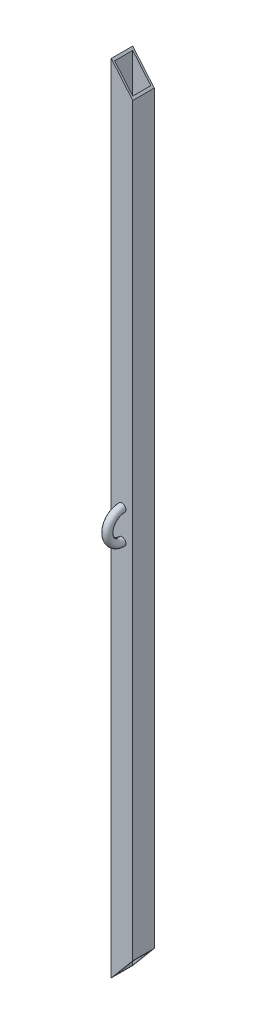
ISO-10303-21;
HEADER;
FILE_DESCRIPTION(('STEP AP214'),'2;1');
FILE_NAME('part.step','',(''),(''),'','','');
FILE_SCHEMA(('AUTOMOTIVE_DESIGN { 1 0 10303 214 1 1 1 1 }'));
ENDSEC;
DATA;
#1=APPLICATION_CONTEXT('core data for automotive mechanical design processes');
#2=APPLICATION_PROTOCOL_DEFINITION('international standard','automotive_design',2000,#1);
#3=PRODUCT_CONTEXT('',#1,'mechanical');
#4=PRODUCT('Part','Part','',(#3));
#5=PRODUCT_RELATED_PRODUCT_CATEGORY('part','',(#4));
#6=PRODUCT_DEFINITION_FORMATION('','',#4);
#7=PRODUCT_DEFINITION_CONTEXT('part definition',#1,'design');
#8=PRODUCT_DEFINITION('design','',#6,#7);
#9=PRODUCT_DEFINITION_SHAPE('','',#8);
#10=(LENGTH_UNIT() NAMED_UNIT(*) SI_UNIT(.MILLI.,.METRE.));
#11=(NAMED_UNIT(*) PLANE_ANGLE_UNIT() SI_UNIT($,.RADIAN.));
#12=(NAMED_UNIT(*) SI_UNIT($,.STERADIAN.) SOLID_ANGLE_UNIT());
#13=UNCERTAINTY_MEASURE_WITH_UNIT(LENGTH_MEASURE(1.E-05),#10,'distance_accuracy_value','');
#14=(GEOMETRIC_REPRESENTATION_CONTEXT(3) GLOBAL_UNCERTAINTY_ASSIGNED_CONTEXT((#13)) GLOBAL_UNIT_ASSIGNED_CONTEXT((#10,
#11,#12)) REPRESENTATION_CONTEXT('',''));
#15=CARTESIAN_POINT('',(0.,0.,0.));
#16=DIRECTION('',(0.,0.,1.));
#17=DIRECTION('',(1.,0.,0.));
#18=AXIS2_PLACEMENT_3D('',#15,#16,#17);
#19=CARTESIAN_POINT('',(-13.335,1174.75,-13.335));
#20=DIRECTION('',(0.,0.,1.));
#21=DIRECTION('',(1.,0.,0.));
#22=AXIS2_PLACEMENT_3D('',#19,#20,#21);
#23=PLANE('',#22);
#24=DIRECTION('',(-0.642787609686538,-0.766044443118979,0.));
#25=VECTOR('',#24,1.);
#26=CARTESIAN_POINT('',(563.625920739908,690.622304203441,-13.335));
#27=LINE('',#26,#25);
#28=CARTESIAN_POINT('',(13.335,34.811122439677,-13.335));
#29=VERTEX_POINT('',#28);
#30=CARTESIAN_POINT('',(-13.335,3.02705412518911,-13.335));
#31=VERTEX_POINT('',#30);
#32=EDGE_CURVE('E11',#29,#31,#27,.T.);
#33=ORIENTED_EDGE('',*,*,#32,.F.);
#34=DIRECTION('',(0.,-1.,0.));
#35=VECTOR('',#34,1.);
#36=CARTESIAN_POINT('',(13.335,1174.75,-13.335));
#37=LINE('',#36,#35);
#38=CARTESIAN_POINT('',(13.335,1139.93887756032,-13.335));
#39=VERTEX_POINT('',#38);
#40=EDGE_CURVE('E152',#39,#29,#37,.T.);
#41=ORIENTED_EDGE('',*,*,#40,.F.);
#42=DIRECTION('',(0.642787609686538,-0.766044443118979,0.));
#43=VECTOR('',#42,1.);
#44=CARTESIAN_POINT('',(-14.825533185637,1173.49929415367,-13.335));
#45=LINE('',#44,#43);
#46=CARTESIAN_POINT('',(-13.335,1171.72294587481,-13.335));
#47=VERTEX_POINT('',#46);
#48=EDGE_CURVE('E47',#47,#39,#45,.T.);
#49=ORIENTED_EDGE('',*,*,#48,.F.);
#50=DIRECTION('',(0.,-1.,0.));
#51=VECTOR('',#50,1.);
#52=CARTESIAN_POINT('',(-13.335,1174.75,-13.335));
#53=LINE('',#52,#51);
#54=EDGE_CURVE('E156',#47,#31,#53,.T.);
#55=ORIENTED_EDGE('',*,*,#54,.T.);
#56=EDGE_LOOP('',(#33,#41,#49,#55));
#57=FACE_BOUND('',#56,.T.);
#58=ADVANCED_FACE('F38',(#57),#23,.T.);
#59=CARTESIAN_POINT('',(13.335,1174.75,-13.335));
#60=DIRECTION('',(-1.,0.,0.));
#61=DIRECTION('',(0.,0.,1.));
#62=AXIS2_PLACEMENT_3D('',#59,#60,#61);
#63=PLANE('',#62);
#64=DIRECTION('',(0.,0.,-1.));
#65=VECTOR('',#64,1.);
#66=CARTESIAN_POINT('',(13.335,34.811122439677,-13.3349999999998));
#67=LINE('',#66,#65);
#68=CARTESIAN_POINT('',(13.335,34.811122439677,13.335));
#69=VERTEX_POINT('',#68);
#70=EDGE_CURVE('E166',#69,#29,#67,.T.);
#71=ORIENTED_EDGE('',*,*,#70,.F.);
#72=DIRECTION('',(0.,-1.,0.));
#73=VECTOR('',#72,1.);
#74=CARTESIAN_POINT('',(13.335,1174.75,13.335));
#75=LINE('',#74,#73);
#76=CARTESIAN_POINT('',(13.335,1139.93887756032,13.335));
#77=VERTEX_POINT('',#76);
#78=EDGE_CURVE('E148',#77,#69,#75,.T.);
#79=ORIENTED_EDGE('',*,*,#78,.F.);
#80=DIRECTION('',(0.,0.,1.));
#81=VECTOR('',#80,1.);
#82=CARTESIAN_POINT('',(13.335,1139.93887756032,-13.335));
#83=LINE('',#82,#81);
#84=EDGE_CURVE('E120',#39,#77,#83,.T.);
#85=ORIENTED_EDGE('',*,*,#84,.F.);
#86=ORIENTED_EDGE('',*,*,#40,.T.);
#87=EDGE_LOOP('',(#71,#79,#85,#86));
#88=FACE_BOUND('',#87,.T.);
#89=ADVANCED_FACE('F225',(#88),#63,.T.);
#90=CARTESIAN_POINT('',(-13.335,1174.75,13.335));
#91=DIRECTION('',(0.,0.,-1.));
#92=DIRECTION('',(-1.,0.,0.));
#93=AXIS2_PLACEMENT_3D('',#90,#91,#92);
#94=PLANE('',#93);
#95=DIRECTION('',(0.642787609686538,0.766044443118979,0.));
#96=VECTOR('',#95,1.);
#97=CARTESIAN_POINT('',(563.625920739908,690.622304203441,13.335));
#98=LINE('',#97,#96);
#99=CARTESIAN_POINT('',(-13.335,3.02705412518911,13.335));
#100=VERTEX_POINT('',#99);
#101=EDGE_CURVE('E163',#100,#69,#98,.T.);
#102=ORIENTED_EDGE('',*,*,#101,.F.);
#103=DIRECTION('',(0.,-1.,0.));
#104=VECTOR('',#103,1.);
#105=CARTESIAN_POINT('',(-13.335,1174.75,13.335));
#106=LINE('',#105,#104);
#107=CARTESIAN_POINT('',(-13.335,1171.72294587481,13.335));
#108=VERTEX_POINT('',#107);
#109=EDGE_CURVE('E142',#108,#100,#106,.T.);
#110=ORIENTED_EDGE('',*,*,#109,.F.);
#111=DIRECTION('',(-0.642787609686538,0.766044443118979,0.));
#112=VECTOR('',#111,1.);
#113=CARTESIAN_POINT('',(-14.825533185637,1173.49929415367,13.335));
#114=LINE('',#113,#112);
#115=EDGE_CURVE('E171',#77,#108,#114,.T.);
#116=ORIENTED_EDGE('',*,*,#115,.F.);
#117=ORIENTED_EDGE('',*,*,#78,.T.);
#118=EDGE_LOOP('',(#102,#110,#116,#117));
#119=FACE_BOUND('',#118,.T.);
#120=ADVANCED_FACE('F220',(#119),#94,.T.);
#121=CARTESIAN_POINT('',(-13.335,1174.75,-13.335));
#122=DIRECTION('',(1.,0.,0.));
#123=DIRECTION('',(0.,0.,-1.));
#124=AXIS2_PLACEMENT_3D('',#121,#122,#123);
#125=PLANE('',#124);
#126=DIRECTION('',(0.,0.,1.));
#127=VECTOR('',#126,1.);
#128=CARTESIAN_POINT('',(-13.335,3.02705412518933,-13.3349999999998));
#129=LINE('',#128,#127);
#130=EDGE_CURVE('E160',#31,#100,#129,.T.);
#131=ORIENTED_EDGE('',*,*,#130,.F.);
#132=ORIENTED_EDGE('',*,*,#54,.F.);
#133=DIRECTION('',(0.,0.,-1.));
#134=VECTOR('',#133,1.);
#135=CARTESIAN_POINT('',(-13.335,1171.72294587481,-13.335));
#136=LINE('',#135,#134);
#137=EDGE_CURVE('E62',#108,#47,#136,.T.);
#138=ORIENTED_EDGE('',*,*,#137,.F.);
#139=ORIENTED_EDGE('',*,*,#109,.T.);
#140=EDGE_LOOP('',(#131,#132,#138,#139));
#141=FACE_BOUND('',#140,.T.);
#142=ADVANCED_FACE('F212',(#141),#125,.T.);
#143=CARTESIAN_POINT('',(-15.875,1174.75,-15.875));
#144=DIRECTION('',(-0.766044443118979,-0.642787609686538,0.));
#145=DIRECTION('',(0.642787609686538,-0.766044443118979,0.));
#146=AXIS2_PLACEMENT_3D('',#143,#144,#145);
#147=PLANE('',#146);
#148=ORIENTED_EDGE('',*,*,#137,.T.);
#149=ORIENTED_EDGE('',*,*,#48,.T.);
#150=ORIENTED_EDGE('',*,*,#84,.T.);
#151=ORIENTED_EDGE('',*,*,#115,.T.);
#152=EDGE_LOOP('',(#148,#149,#150,#151));
#153=FACE_BOUND('',#152,.T.);
#154=DIRECTION('',(0.642787609686538,-0.766044443118979,0.));
#155=VECTOR('',#154,1.);
#156=CARTESIAN_POINT('',(-15.875,1174.75,15.875));
#157=LINE('',#156,#155);
#158=CARTESIAN_POINT('',(-15.875,1174.75,15.875));
#159=VERTEX_POINT('',#158);
#160=CARTESIAN_POINT('',(15.875,1136.91182343513,15.875));
#161=VERTEX_POINT('',#160);
#162=EDGE_CURVE('E179',#159,#161,#157,.T.);
#163=ORIENTED_EDGE('',*,*,#162,.T.);
#164=DIRECTION('',(0.,0.,1.));
#165=VECTOR('',#164,1.);
#166=CARTESIAN_POINT('',(15.875,1136.91182343513,-15.875));
#167=LINE('',#166,#165);
#168=CARTESIAN_POINT('',(15.875,1136.91182343513,-15.875));
#169=VERTEX_POINT('',#168);
#170=EDGE_CURVE('E176',#169,#161,#167,.T.);
#171=ORIENTED_EDGE('',*,*,#170,.F.);
#172=DIRECTION('',(0.642787609686538,-0.766044443118979,0.));
#173=VECTOR('',#172,1.);
#174=CARTESIAN_POINT('',(-15.875,1174.75,-15.875));
#175=LINE('',#174,#173);
#176=CARTESIAN_POINT('',(-15.875,1174.75,-15.875));
#177=VERTEX_POINT('',#176);
#178=EDGE_CURVE('E124',#177,#169,#175,.T.);
#179=ORIENTED_EDGE('',*,*,#178,.F.);
#180=DIRECTION('',(0.,0.,1.));
#181=VECTOR('',#180,1.);
#182=CARTESIAN_POINT('',(-15.875,1174.75,-15.875));
#183=LINE('',#182,#181);
#184=EDGE_CURVE('E139',#177,#159,#183,.T.);
#185=ORIENTED_EDGE('',*,*,#184,.T.);
#186=EDGE_LOOP('',(#163,#171,#179,#185));
#187=FACE_BOUND('',#186,.T.);
#188=ADVANCED_FACE('F210',(#153,#187),#147,.F.);
#189=CARTESIAN_POINT('',(-15.875,0.,-15.875));
#190=DIRECTION('',(-0.766044443118979,0.642787609686538,0.));
#191=DIRECTION('',(-0.642787609686538,-0.766044443118979,0.));
#192=AXIS2_PLACEMENT_3D('',#189,#190,#191);
#193=PLANE('',#192);
#194=ORIENTED_EDGE('',*,*,#130,.T.);
#195=ORIENTED_EDGE('',*,*,#101,.T.);
#196=ORIENTED_EDGE('',*,*,#70,.T.);
#197=ORIENTED_EDGE('',*,*,#32,.T.);
#198=EDGE_LOOP('',(#194,#195,#196,#197));
#199=FACE_BOUND('',#198,.T.);
#200=DIRECTION('',(-0.642787609686538,-0.766044443118979,0.));
#201=VECTOR('',#200,1.);
#202=CARTESIAN_POINT('',(-15.875,0.,15.875));
#203=LINE('',#202,#201);
#204=CARTESIAN_POINT('',(15.875,37.8381765648663,15.875));
#205=VERTEX_POINT('',#204);
#206=CARTESIAN_POINT('',(-15.875,0.,15.875));
#207=VERTEX_POINT('',#206);
#208=EDGE_CURVE('E110',#205,#207,#203,.T.);
#209=ORIENTED_EDGE('',*,*,#208,.T.);
#210=DIRECTION('',(0.,0.,1.));
#211=VECTOR('',#210,1.);
#212=CARTESIAN_POINT('',(-15.875,0.,-15.875));
#213=LINE('',#212,#211);
#214=CARTESIAN_POINT('',(-15.875,0.,-15.875));
#215=VERTEX_POINT('',#214);
#216=EDGE_CURVE('E104',#215,#207,#213,.T.);
#217=ORIENTED_EDGE('',*,*,#216,.F.);
#218=DIRECTION('',(-0.642787609686538,-0.766044443118979,0.));
#219=VECTOR('',#218,1.);
#220=CARTESIAN_POINT('',(-15.875,0.,-15.875));
#221=LINE('',#220,#219);
#222=CARTESIAN_POINT('',(15.875,37.8381765648663,-15.875));
#223=VERTEX_POINT('',#222);
#224=EDGE_CURVE('E101',#223,#215,#221,.T.);
#225=ORIENTED_EDGE('',*,*,#224,.F.);
#226=DIRECTION('',(0.,0.,1.));
#227=VECTOR('',#226,1.);
#228=CARTESIAN_POINT('',(15.875,37.8381765648663,-15.875));
#229=LINE('',#228,#227);
#230=EDGE_CURVE('E54',#223,#205,#229,.T.);
#231=ORIENTED_EDGE('',*,*,#230,.T.);
#232=EDGE_LOOP('',(#209,#217,#225,#231));
#233=FACE_BOUND('',#232,.T.);
#234=ADVANCED_FACE('F102',(#199,#233),#193,.F.);
#235=CARTESIAN_POINT('',(15.875,1174.75,-15.875));
#236=DIRECTION('',(-1.,0.,0.));
#237=DIRECTION('',(0.,0.,1.));
#238=AXIS2_PLACEMENT_3D('',#235,#236,#237);
#239=PLANE('',#238);
#240=DIRECTION('',(0.,-1.,0.));
#241=VECTOR('',#240,1.);
#242=CARTESIAN_POINT('',(15.875,1174.75,15.875));
#243=LINE('',#242,#241);
#244=EDGE_CURVE('E118',#161,#205,#243,.T.);
#245=ORIENTED_EDGE('',*,*,#244,.T.);
#246=ORIENTED_EDGE('',*,*,#230,.F.);
#247=DIRECTION('',(0.,-1.,0.));
#248=VECTOR('',#247,1.);
#249=CARTESIAN_POINT('',(15.875,1174.75,-15.875));
#250=LINE('',#249,#248);
#251=EDGE_CURVE('E116',#169,#223,#250,.T.);
#252=ORIENTED_EDGE('',*,*,#251,.F.);
#253=ORIENTED_EDGE('',*,*,#170,.T.);
#254=EDGE_LOOP('',(#245,#246,#252,#253));
#255=FACE_BOUND('',#254,.T.);
#256=ADVANCED_FACE('F40',(#255),#239,.F.);
#257=CARTESIAN_POINT('',(-15.875,1174.75,-15.875));
#258=DIRECTION('',(0.,0.,1.));
#259=DIRECTION('',(1.,0.,0.));
#260=AXIS2_PLACEMENT_3D('',#257,#258,#259);
#261=PLANE('',#260);
#262=ORIENTED_EDGE('',*,*,#251,.T.);
#263=ORIENTED_EDGE('',*,*,#224,.T.);
#264=DIRECTION('',(0.,-1.,0.));
#265=VECTOR('',#264,1.);
#266=CARTESIAN_POINT('',(-15.875,1174.75,-15.875));
#267=LINE('',#266,#265);
#268=EDGE_CURVE('E126',#177,#215,#267,.T.);
#269=ORIENTED_EDGE('',*,*,#268,.F.);
#270=ORIENTED_EDGE('',*,*,#178,.T.);
#271=EDGE_LOOP('',(#262,#263,#269,#270));
#272=FACE_BOUND('',#271,.T.);
#273=ADVANCED_FACE('F123',(#272),#261,.F.);
#274=CARTESIAN_POINT('',(-15.875,1174.75,-15.875));
#275=DIRECTION('',(1.,0.,0.));
#276=DIRECTION('',(0.,0.,-1.));
#277=AXIS2_PLACEMENT_3D('',#274,#275,#276);
#278=PLANE('',#277);
#279=ORIENTED_EDGE('',*,*,#216,.T.);
#280=DIRECTION('',(0.,-1.,0.));
#281=VECTOR('',#280,1.);
#282=CARTESIAN_POINT('',(-15.875,1174.75,15.875));
#283=LINE('',#282,#281);
#284=EDGE_CURVE('E131',#159,#207,#283,.T.);
#285=ORIENTED_EDGE('',*,*,#284,.F.);
#286=ORIENTED_EDGE('',*,*,#184,.F.);
#287=ORIENTED_EDGE('',*,*,#268,.T.);
#288=EDGE_LOOP('',(#279,#285,#286,#287));
#289=FACE_BOUND('',#288,.T.);
#290=ADVANCED_FACE('F201',(#289),#278,.F.);
#291=CARTESIAN_POINT('',(-15.875,1174.75,15.875));
#292=DIRECTION('',(0.,0.,-1.));
#293=DIRECTION('',(-1.,0.,0.));
#294=AXIS2_PLACEMENT_3D('',#291,#292,#293);
#295=PLANE('',#294);
#296=CARTESIAN_POINT('',(0.,608.965,15.875));
#297=DIRECTION('',(0.,0.,1.));
#298=DIRECTION('',(1.,0.,0.));
#299=AXIS2_PLACEMENT_3D('',#296,#297,#298);
#300=CIRCLE('',#299,5.842);
#301=CARTESIAN_POINT('',(0.,614.807,15.875));
#302=VERTEX_POINT('',#301);
#303=EDGE_CURVE('E190',#302,#302,#300,.T.);
#304=ORIENTED_EDGE('',*,*,#303,.F.);
#305=EDGE_LOOP('',(#304));
#306=FACE_BOUND('',#305,.T.);
#307=CARTESIAN_POINT('',(0.,565.785,15.875));
#308=DIRECTION('',(0.,0.,-1.));
#309=DIRECTION('',(1.,0.,0.));
#310=AXIS2_PLACEMENT_3D('',#307,#308,#309);
#311=CIRCLE('',#310,5.842);
#312=CARTESIAN_POINT('',(0.,559.943,15.875));
#313=VERTEX_POINT('',#312);
#314=EDGE_CURVE('E182',#313,#313,#311,.T.);
#315=ORIENTED_EDGE('',*,*,#314,.T.);
#316=EDGE_LOOP('',(#315));
#317=FACE_BOUND('',#316,.T.);
#318=ORIENTED_EDGE('',*,*,#284,.T.);
#319=ORIENTED_EDGE('',*,*,#208,.F.);
#320=ORIENTED_EDGE('',*,*,#244,.F.);
#321=ORIENTED_EDGE('',*,*,#162,.F.);
#322=EDGE_LOOP('',(#318,#319,#320,#321));
#323=FACE_BOUND('',#322,.T.);
#324=ADVANCED_FACE('F198',(#306,#317,#323),#295,.F.);
#325=CARTESIAN_POINT('',(0.,587.375,15.8750000000001));
#326=DIRECTION('',(1.,0.,0.));
#327=DIRECTION('',(0.,0.,-1.));
#328=AXIS2_PLACEMENT_3D('',#325,#326,#327);
#329=TOROIDAL_SURFACE('',#328,21.59,5.842);
#330=CARTESIAN_POINT('',(0.,587.375,15.8750000000001));
#331=DIRECTION('',(1.,0.,0.));
#332=DIRECTION('',(0.,0.,-1.));
#333=AXIS2_PLACEMENT_3D('',#330,#331,#332);
#334=CIRCLE('',#333,27.432);
#335=EDGE_CURVE('',#302,#313,#334,.T.);
#336=ORIENTED_EDGE('',*,*,#303,.T.);
#337=ORIENTED_EDGE('',*,*,#314,.F.);
#338=ORIENTED_EDGE('',*,*,#335,.T.);
#339=ORIENTED_EDGE('',*,*,#335,.F.);
#340=EDGE_LOOP('',(#336,#338,#337,#339));
#341=FACE_BOUND('',#340,.T.);
#342=ADVANCED_FACE('F196',(#341),#329,.T.);
#343=CLOSED_SHELL('',(#58,#89,#120,#142,#188,#234,#256,#273,#290,#324,#342));
#344=MANIFOLD_SOLID_BREP('B2',#343);
#345=ADVANCED_BREP_SHAPE_REPRESENTATION('',(#18,#344),#14);
#346=SHAPE_DEFINITION_REPRESENTATION(#9,#345);
ENDSEC;
END-ISO-10303-21;
